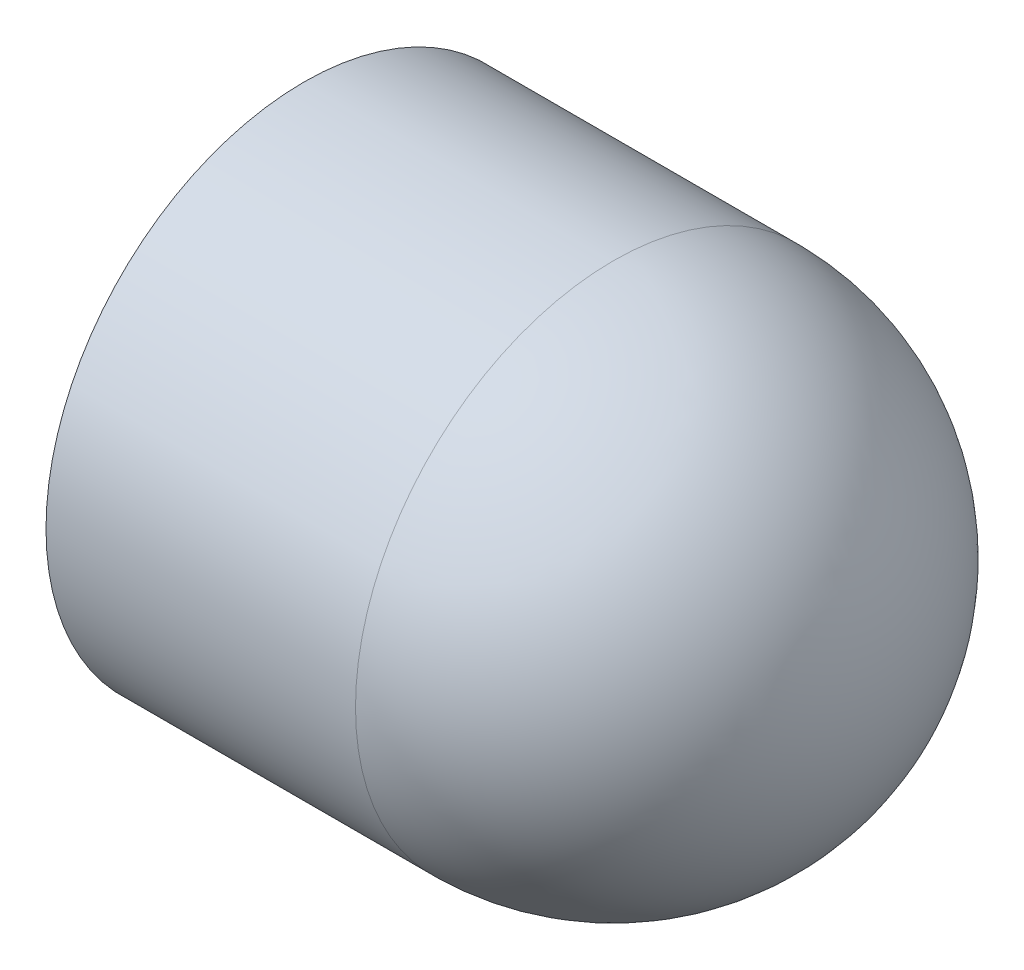
ISO-10303-21;
HEADER;
FILE_DESCRIPTION(('STEP AP214'),'2;1');
FILE_NAME('part.step','',(''),(''),'','','');
FILE_SCHEMA(('AUTOMOTIVE_DESIGN { 1 0 10303 214 1 1 1 1 }'));
ENDSEC;
DATA;
#1=APPLICATION_CONTEXT('core data for automotive mechanical design processes');
#2=APPLICATION_PROTOCOL_DEFINITION('international standard','automotive_design',2000,#1);
#3=PRODUCT_CONTEXT('',#1,'mechanical');
#4=PRODUCT('Part','Part','',(#3));
#5=PRODUCT_RELATED_PRODUCT_CATEGORY('part','',(#4));
#6=PRODUCT_DEFINITION_FORMATION('','',#4);
#7=PRODUCT_DEFINITION_CONTEXT('part definition',#1,'design');
#8=PRODUCT_DEFINITION('design','',#6,#7);
#9=PRODUCT_DEFINITION_SHAPE('','',#8);
#10=(LENGTH_UNIT() NAMED_UNIT(*) SI_UNIT(.MILLI.,.METRE.));
#11=(NAMED_UNIT(*) PLANE_ANGLE_UNIT() SI_UNIT($,.RADIAN.));
#12=(NAMED_UNIT(*) SI_UNIT($,.STERADIAN.) SOLID_ANGLE_UNIT());
#13=UNCERTAINTY_MEASURE_WITH_UNIT(LENGTH_MEASURE(1.E-05),#10,'distance_accuracy_value','');
#14=(GEOMETRIC_REPRESENTATION_CONTEXT(3) GLOBAL_UNCERTAINTY_ASSIGNED_CONTEXT((#13)) GLOBAL_UNIT_ASSIGNED_CONTEXT((#10,
#11,#12)) REPRESENTATION_CONTEXT('',''));
#15=CARTESIAN_POINT('',(0.,0.,0.));
#16=DIRECTION('',(0.,0.,1.));
#17=DIRECTION('',(1.,0.,0.));
#18=AXIS2_PLACEMENT_3D('',#15,#16,#17);
#19=CARTESIAN_POINT('',(0.,0.,0.));
#20=DIRECTION('',(1.,0.,0.));
#21=DIRECTION('',(0.,0.,-1.));
#22=AXIS2_PLACEMENT_3D('',#19,#20,#21);
#23=PLANE('',#22);
#24=CARTESIAN_POINT('',(0.,0.,0.));
#25=DIRECTION('',(1.,0.,0.));
#26=DIRECTION('',(0.,0.,-1.));
#27=AXIS2_PLACEMENT_3D('',#24,#25,#26);
#28=CIRCLE('',#27,25.);
#29=CARTESIAN_POINT('',(0.,0.,-25.));
#30=VERTEX_POINT('',#29);
#31=EDGE_CURVE('E45',#30,#30,#28,.T.);
#32=ORIENTED_EDGE('',*,*,#31,.F.);
#33=EDGE_LOOP('',(#32));
#34=FACE_BOUND('',#33,.T.);
#35=DIRECTION('',(0.,-1.,0.));
#36=VECTOR('',#35,1.);
#37=CARTESIAN_POINT('',(0.,10.,2.5));
#38=LINE('',#37,#36);
#39=CARTESIAN_POINT('',(0.,10.,2.5));
#40=VERTEX_POINT('',#39);
#41=CARTESIAN_POINT('',(0.,7.59934207678533,2.5));
#42=VERTEX_POINT('',#41);
#43=EDGE_CURVE('E60',#40,#42,#38,.T.);
#44=ORIENTED_EDGE('',*,*,#43,.T.);
#45=CARTESIAN_POINT('',(0.,0.,0.));
#46=DIRECTION('',(1.,0.,0.));
#47=DIRECTION('',(0.,0.,-1.));
#48=AXIS2_PLACEMENT_3D('',#45,#46,#47);
#49=CIRCLE('',#48,8.);
#50=CARTESIAN_POINT('',(0.,7.59934207678533,-2.5));
#51=VERTEX_POINT('',#50);
#52=EDGE_CURVE('E113',#42,#51,#49,.T.);
#53=ORIENTED_EDGE('',*,*,#52,.T.);
#54=DIRECTION('',(0.,1.,0.));
#55=VECTOR('',#54,1.);
#56=CARTESIAN_POINT('',(0.,10.,-2.5));
#57=LINE('',#56,#55);
#58=CARTESIAN_POINT('',(0.,10.,-2.5));
#59=VERTEX_POINT('',#58);
#60=EDGE_CURVE('E96',#51,#59,#57,.T.);
#61=ORIENTED_EDGE('',*,*,#60,.T.);
#62=DIRECTION('',(0.,0.,1.));
#63=VECTOR('',#62,1.);
#64=CARTESIAN_POINT('',(0.,10.,2.5));
#65=LINE('',#64,#63);
#66=EDGE_CURVE('E115',#59,#40,#65,.T.);
#67=ORIENTED_EDGE('',*,*,#66,.T.);
#68=EDGE_LOOP('',(#44,#53,#61,#67));
#69=FACE_BOUND('',#68,.T.);
#70=ADVANCED_FACE('F37',(#34,#69),#23,.F.);
#71=CARTESIAN_POINT('',(15.,0.,0.));
#72=DIRECTION('',(-1.,0.,0.));
#73=DIRECTION('',(0.,0.,1.));
#74=AXIS2_PLACEMENT_3D('',#71,#72,#73);
#75=CYLINDRICAL_SURFACE('',#74,25.);
#76=CARTESIAN_POINT('',(30.,0.,0.));
#77=DIRECTION('',(-1.,0.,0.));
#78=DIRECTION('',(0.,0.,1.));
#79=AXIS2_PLACEMENT_3D('',#76,#77,#78);
#80=CIRCLE('',#79,25.);
#81=CARTESIAN_POINT('',(30.,0.,25.));
#82=VERTEX_POINT('',#81);
#83=EDGE_CURVE('E11',#82,#82,#80,.T.);
#84=ORIENTED_EDGE('',*,*,#83,.T.);
#85=EDGE_LOOP('',(#84));
#86=FACE_BOUND('',#85,.T.);
#87=ORIENTED_EDGE('',*,*,#31,.T.);
#88=EDGE_LOOP('',(#87));
#89=FACE_BOUND('',#88,.T.);
#90=ADVANCED_FACE('F107',(#86,#89),#75,.T.);
#91=CARTESIAN_POINT('',(15.,10.,2.5));
#92=DIRECTION('',(0.,0.,-1.));
#93=DIRECTION('',(0.,1.,0.));
#94=AXIS2_PLACEMENT_3D('',#91,#92,#93);
#95=PLANE('',#94);
#96=ORIENTED_EDGE('',*,*,#43,.F.);
#97=DIRECTION('',(-1.,0.,0.));
#98=VECTOR('',#97,1.);
#99=CARTESIAN_POINT('',(15.,10.,2.5));
#100=LINE('',#99,#98);
#101=CARTESIAN_POINT('',(15.,10.,2.5));
#102=VERTEX_POINT('',#101);
#103=EDGE_CURVE('E101',#102,#40,#100,.T.);
#104=ORIENTED_EDGE('',*,*,#103,.F.);
#105=DIRECTION('',(0.,-1.,0.));
#106=VECTOR('',#105,1.);
#107=CARTESIAN_POINT('',(15.,10.,2.5));
#108=LINE('',#107,#106);
#109=CARTESIAN_POINT('',(15.,7.59934207678533,2.5));
#110=VERTEX_POINT('',#109);
#111=EDGE_CURVE('E92',#102,#110,#108,.T.);
#112=ORIENTED_EDGE('',*,*,#111,.T.);
#113=DIRECTION('',(-1.,0.,0.));
#114=VECTOR('',#113,1.);
#115=CARTESIAN_POINT('',(15.,7.59934207678533,2.5));
#116=LINE('',#115,#114);
#117=EDGE_CURVE('E91',#110,#42,#116,.T.);
#118=ORIENTED_EDGE('',*,*,#117,.T.);
#119=EDGE_LOOP('',(#96,#104,#112,#118));
#120=FACE_BOUND('',#119,.T.);
#121=ADVANCED_FACE('F123',(#120),#95,.T.);
#122=CARTESIAN_POINT('',(15.,0.,0.));
#123=DIRECTION('',(-1.,0.,0.));
#124=DIRECTION('',(0.,0.,1.));
#125=AXIS2_PLACEMENT_3D('',#122,#123,#124);
#126=CYLINDRICAL_SURFACE('',#125,8.);
#127=ORIENTED_EDGE('',*,*,#52,.F.);
#128=ORIENTED_EDGE('',*,*,#117,.F.);
#129=CARTESIAN_POINT('',(15.,0.,0.));
#130=DIRECTION('',(1.,0.,0.));
#131=DIRECTION('',(0.,0.,-1.));
#132=AXIS2_PLACEMENT_3D('',#129,#130,#131);
#133=CIRCLE('',#132,8.);
#134=CARTESIAN_POINT('',(15.,7.59934207678533,-2.5));
#135=VERTEX_POINT('',#134);
#136=EDGE_CURVE('E81',#110,#135,#133,.T.);
#137=ORIENTED_EDGE('',*,*,#136,.T.);
#138=DIRECTION('',(-1.,0.,0.));
#139=VECTOR('',#138,1.);
#140=CARTESIAN_POINT('',(15.,7.59934207678533,-2.5));
#141=LINE('',#140,#139);
#142=EDGE_CURVE('E89',#135,#51,#141,.T.);
#143=ORIENTED_EDGE('',*,*,#142,.T.);
#144=EDGE_LOOP('',(#127,#128,#137,#143));
#145=FACE_BOUND('',#144,.T.);
#146=ADVANCED_FACE('F88',(#145),#126,.F.);
#147=CARTESIAN_POINT('',(15.,10.,-2.5));
#148=DIRECTION('',(0.,0.,1.));
#149=DIRECTION('',(0.,-1.,0.));
#150=AXIS2_PLACEMENT_3D('',#147,#148,#149);
#151=PLANE('',#150);
#152=ORIENTED_EDGE('',*,*,#60,.F.);
#153=ORIENTED_EDGE('',*,*,#142,.F.);
#154=DIRECTION('',(0.,1.,0.));
#155=VECTOR('',#154,1.);
#156=CARTESIAN_POINT('',(15.,10.,-2.5));
#157=LINE('',#156,#155);
#158=CARTESIAN_POINT('',(15.,10.,-2.5));
#159=VERTEX_POINT('',#158);
#160=EDGE_CURVE('E78',#135,#159,#157,.T.);
#161=ORIENTED_EDGE('',*,*,#160,.T.);
#162=DIRECTION('',(-1.,0.,0.));
#163=VECTOR('',#162,1.);
#164=CARTESIAN_POINT('',(15.,10.,-2.5));
#165=LINE('',#164,#163);
#166=EDGE_CURVE('E98',#159,#59,#165,.T.);
#167=ORIENTED_EDGE('',*,*,#166,.T.);
#168=EDGE_LOOP('',(#152,#153,#161,#167));
#169=FACE_BOUND('',#168,.T.);
#170=ADVANCED_FACE('F94',(#169),#151,.T.);
#171=CARTESIAN_POINT('',(15.,10.,2.5));
#172=DIRECTION('',(0.,-1.,0.));
#173=DIRECTION('',(0.,0.,-1.));
#174=AXIS2_PLACEMENT_3D('',#171,#172,#173);
#175=PLANE('',#174);
#176=ORIENTED_EDGE('',*,*,#66,.F.);
#177=ORIENTED_EDGE('',*,*,#166,.F.);
#178=DIRECTION('',(0.,0.,1.));
#179=VECTOR('',#178,1.);
#180=CARTESIAN_POINT('',(15.,10.,2.5));
#181=LINE('',#180,#179);
#182=EDGE_CURVE('E52',#159,#102,#181,.T.);
#183=ORIENTED_EDGE('',*,*,#182,.T.);
#184=ORIENTED_EDGE('',*,*,#103,.T.);
#185=EDGE_LOOP('',(#176,#177,#183,#184));
#186=FACE_BOUND('',#185,.T.);
#187=ADVANCED_FACE('F122',(#186),#175,.T.);
#188=CARTESIAN_POINT('',(15.,0.,0.));
#189=DIRECTION('',(1.,0.,0.));
#190=DIRECTION('',(0.,0.,-1.));
#191=AXIS2_PLACEMENT_3D('',#188,#189,#190);
#192=PLANE('',#191);
#193=ORIENTED_EDGE('',*,*,#136,.F.);
#194=ORIENTED_EDGE('',*,*,#111,.F.);
#195=ORIENTED_EDGE('',*,*,#182,.F.);
#196=ORIENTED_EDGE('',*,*,#160,.F.);
#197=EDGE_LOOP('',(#193,#194,#195,#196));
#198=FACE_BOUND('',#197,.T.);
#199=ADVANCED_FACE('F80',(#198),#192,.F.);
#200=CARTESIAN_POINT('',(30.,0.,0.));
#201=DIRECTION('',(1.,0.,0.));
#202=DIRECTION('',(0.,0.,-1.));
#203=AXIS2_PLACEMENT_3D('',#200,#201,#202);
#204=SPHERICAL_SURFACE('',#203,25.);
#205=ORIENTED_EDGE('',*,*,#83,.F.);
#206=EDGE_LOOP('',(#205));
#207=FACE_BOUND('',#206,.T.);
#208=ADVANCED_FACE('F39',(#207),#204,.T.);
#209=CLOSED_SHELL('',(#70,#90,#121,#146,#170,#187,#199,#208));
#210=MANIFOLD_SOLID_BREP('B2',#209);
#211=ADVANCED_BREP_SHAPE_REPRESENTATION('',(#18,#210),#14);
#212=SHAPE_DEFINITION_REPRESENTATION(#9,#211);
ENDSEC;
END-ISO-10303-21;
